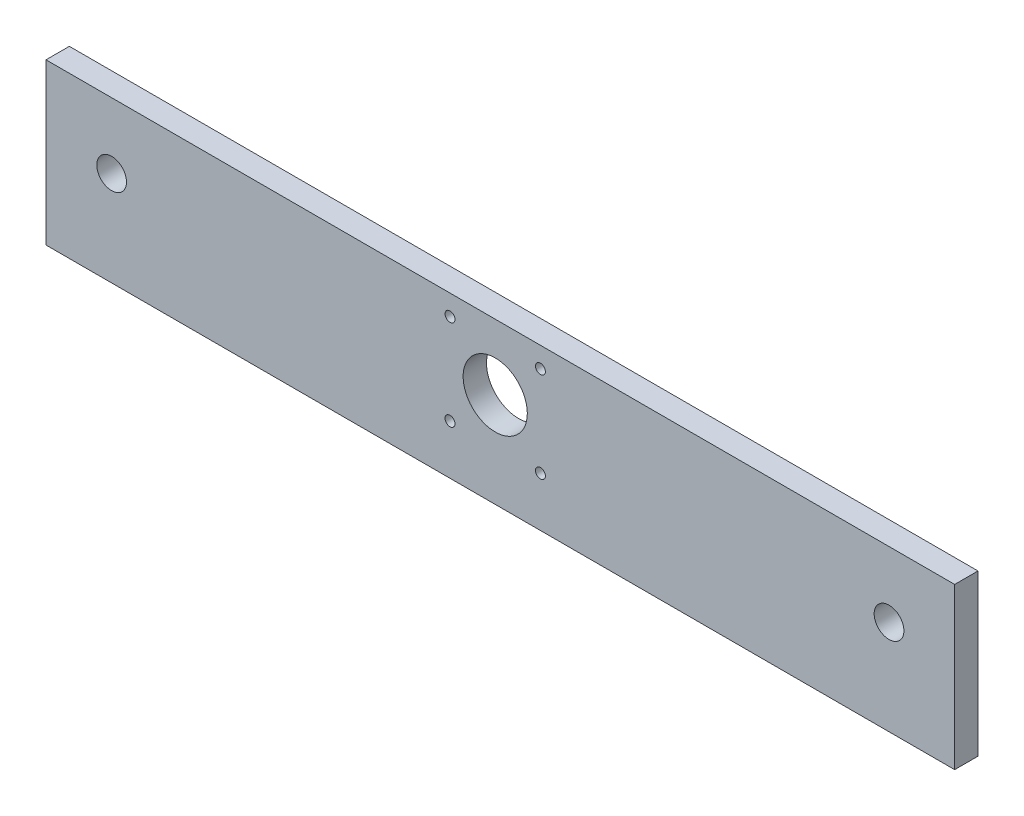
ISO-10303-21;
HEADER;
FILE_DESCRIPTION(('STEP AP214'),'2;1');
FILE_NAME('part.step','',(''),(''),'','','');
FILE_SCHEMA(('AUTOMOTIVE_DESIGN { 1 0 10303 214 1 1 1 1 }'));
ENDSEC;
DATA;
#1=APPLICATION_CONTEXT('core data for automotive mechanical design processes');
#2=APPLICATION_PROTOCOL_DEFINITION('international standard','automotive_design',2000,#1);
#3=PRODUCT_CONTEXT('',#1,'mechanical');
#4=PRODUCT('Part','Part','',(#3));
#5=PRODUCT_RELATED_PRODUCT_CATEGORY('part','',(#4));
#6=PRODUCT_DEFINITION_FORMATION('','',#4);
#7=PRODUCT_DEFINITION_CONTEXT('part definition',#1,'design');
#8=PRODUCT_DEFINITION('design','',#6,#7);
#9=PRODUCT_DEFINITION_SHAPE('','',#8);
#10=(LENGTH_UNIT() NAMED_UNIT(*) SI_UNIT(.MILLI.,.METRE.));
#11=(NAMED_UNIT(*) PLANE_ANGLE_UNIT() SI_UNIT($,.RADIAN.));
#12=(NAMED_UNIT(*) SI_UNIT($,.STERADIAN.) SOLID_ANGLE_UNIT());
#13=UNCERTAINTY_MEASURE_WITH_UNIT(LENGTH_MEASURE(1.E-05),#10,'distance_accuracy_value','');
#14=(GEOMETRIC_REPRESENTATION_CONTEXT(3) GLOBAL_UNCERTAINTY_ASSIGNED_CONTEXT((#13)) GLOBAL_UNIT_ASSIGNED_CONTEXT((#10,
#11,#12)) REPRESENTATION_CONTEXT('',''));
#15=CARTESIAN_POINT('',(0.,0.,0.));
#16=DIRECTION('',(0.,0.,1.));
#17=DIRECTION('',(1.,0.,0.));
#18=AXIS2_PLACEMENT_3D('',#15,#16,#17);
#19=CARTESIAN_POINT('',(-155.75,0.,4.));
#20=DIRECTION('',(-1.,0.,0.));
#21=DIRECTION('',(0.,0.,1.));
#22=AXIS2_PLACEMENT_3D('',#19,#20,#21);
#23=PLANE('',#22);
#24=DIRECTION('',(0.,1.,0.));
#25=VECTOR('',#24,1.);
#26=CARTESIAN_POINT('',(-155.75,0.,-4.));
#27=LINE('',#26,#25);
#28=CARTESIAN_POINT('',(-155.75,-32.5,-4.));
#29=VERTEX_POINT('',#28);
#30=CARTESIAN_POINT('',(-155.75,22.5,-4.));
#31=VERTEX_POINT('',#30);
#32=EDGE_CURVE('E166',#29,#31,#27,.T.);
#33=ORIENTED_EDGE('',*,*,#32,.F.);
#34=DIRECTION('',(0.,0.,1.));
#35=VECTOR('',#34,1.);
#36=CARTESIAN_POINT('',(-155.75,-32.5,-4.));
#37=LINE('',#36,#35);
#38=CARTESIAN_POINT('',(-155.75,-32.5,4.));
#39=VERTEX_POINT('',#38);
#40=EDGE_CURVE('E94',#29,#39,#37,.T.);
#41=ORIENTED_EDGE('',*,*,#40,.T.);
#42=DIRECTION('',(0.,1.,0.));
#43=VECTOR('',#42,1.);
#44=CARTESIAN_POINT('',(-155.75,0.,4.));
#45=LINE('',#44,#43);
#46=CARTESIAN_POINT('',(-155.75,22.5,4.));
#47=VERTEX_POINT('',#46);
#48=EDGE_CURVE('E85',#39,#47,#45,.T.);
#49=ORIENTED_EDGE('',*,*,#48,.T.);
#50=DIRECTION('',(0.,0.,-1.));
#51=VECTOR('',#50,1.);
#52=CARTESIAN_POINT('',(-155.75,22.5,4.));
#53=LINE('',#52,#51);
#54=EDGE_CURVE('E47',#47,#31,#53,.T.);
#55=ORIENTED_EDGE('',*,*,#54,.T.);
#56=EDGE_LOOP('',(#33,#41,#49,#55));
#57=FACE_BOUND('',#56,.T.);
#58=ADVANCED_FACE('F39',(#57),#23,.T.);
#59=CARTESIAN_POINT('',(155.75,0.,4.));
#60=DIRECTION('',(-1.,0.,0.));
#61=DIRECTION('',(0.,0.,1.));
#62=AXIS2_PLACEMENT_3D('',#59,#60,#61);
#63=PLANE('',#62);
#64=DIRECTION('',(0.,1.,0.));
#65=VECTOR('',#64,1.);
#66=CARTESIAN_POINT('',(155.75,0.,-4.));
#67=LINE('',#66,#65);
#68=CARTESIAN_POINT('',(155.75,-32.5,-4.));
#69=VERTEX_POINT('',#68);
#70=CARTESIAN_POINT('',(155.75,22.5,-4.));
#71=VERTEX_POINT('',#70);
#72=EDGE_CURVE('E66',#69,#71,#67,.T.);
#73=ORIENTED_EDGE('',*,*,#72,.T.);
#74=DIRECTION('',(0.,0.,-1.));
#75=VECTOR('',#74,1.);
#76=CARTESIAN_POINT('',(155.75,22.5,4.));
#77=LINE('',#76,#75);
#78=CARTESIAN_POINT('',(155.75,22.5,4.));
#79=VERTEX_POINT('',#78);
#80=EDGE_CURVE('E11',#79,#71,#77,.T.);
#81=ORIENTED_EDGE('',*,*,#80,.F.);
#82=DIRECTION('',(0.,1.,0.));
#83=VECTOR('',#82,1.);
#84=CARTESIAN_POINT('',(155.75,0.,4.));
#85=LINE('',#84,#83);
#86=CARTESIAN_POINT('',(155.75,-32.5,4.));
#87=VERTEX_POINT('',#86);
#88=EDGE_CURVE('E79',#87,#79,#85,.T.);
#89=ORIENTED_EDGE('',*,*,#88,.F.);
#90=DIRECTION('',(0.,0.,1.));
#91=VECTOR('',#90,1.);
#92=CARTESIAN_POINT('',(155.75,-32.5,-4.));
#93=LINE('',#92,#91);
#94=EDGE_CURVE('E82',#69,#87,#93,.T.);
#95=ORIENTED_EDGE('',*,*,#94,.F.);
#96=EDGE_LOOP('',(#73,#81,#89,#95));
#97=FACE_BOUND('',#96,.T.);
#98=ADVANCED_FACE('F81',(#97),#63,.F.);
#99=CARTESIAN_POINT('',(0.,22.5,4.));
#100=DIRECTION('',(0.,-1.,0.));
#101=DIRECTION('',(1.,0.,0.));
#102=AXIS2_PLACEMENT_3D('',#99,#100,#101);
#103=PLANE('',#102);
#104=DIRECTION('',(-1.,0.,0.));
#105=VECTOR('',#104,1.);
#106=CARTESIAN_POINT('',(0.,22.5,-4.));
#107=LINE('',#106,#105);
#108=EDGE_CURVE('E169',#71,#31,#107,.T.);
#109=ORIENTED_EDGE('',*,*,#108,.T.);
#110=ORIENTED_EDGE('',*,*,#54,.F.);
#111=DIRECTION('',(-1.,0.,0.));
#112=VECTOR('',#111,1.);
#113=CARTESIAN_POINT('',(0.,22.5,4.));
#114=LINE('',#113,#112);
#115=EDGE_CURVE('E55',#79,#47,#114,.T.);
#116=ORIENTED_EDGE('',*,*,#115,.F.);
#117=ORIENTED_EDGE('',*,*,#80,.T.);
#118=EDGE_LOOP('',(#109,#110,#116,#117));
#119=FACE_BOUND('',#118,.T.);
#120=ADVANCED_FACE('F178',(#119),#103,.F.);
#121=CARTESIAN_POINT('',(0.,0.,4.));
#122=DIRECTION('',(0.,0.,1.));
#123=DIRECTION('',(1.,0.,0.));
#124=AXIS2_PLACEMENT_3D('',#121,#122,#123);
#125=PLANE('',#124);
#126=CARTESIAN_POINT('',(-133.249958453999,1.36934008923562E-06,4.));
#127=DIRECTION('',(0.,0.,1.));
#128=DIRECTION('',(1.,0.,0.));
#129=AXIS2_PLACEMENT_3D('',#126,#127,#128);
#130=CIRCLE('',#129,5.09999999999999);
#131=CARTESIAN_POINT('',(-128.149958453999,1.36934008923562E-06,4.));
#132=VERTEX_POINT('',#131);
#133=EDGE_CURVE('E93',#132,#132,#130,.T.);
#134=ORIENTED_EDGE('',*,*,#133,.F.);
#135=EDGE_LOOP('',(#134));
#136=FACE_BOUND('',#135,.T.);
#137=CARTESIAN_POINT('',(133.24999863065,1.36934406608916E-06,4.));
#138=DIRECTION('',(0.,0.,1.));
#139=DIRECTION('',(1.,0.,0.));
#140=AXIS2_PLACEMENT_3D('',#137,#138,#139);
#141=CIRCLE('',#140,5.09999999999999);
#142=CARTESIAN_POINT('',(138.34999863065,1.36934406608916E-06,4.));
#143=VERTEX_POINT('',#142);
#144=EDGE_CURVE('E108',#143,#143,#141,.T.);
#145=ORIENTED_EDGE('',*,*,#144,.F.);
#146=EDGE_LOOP('',(#145));
#147=FACE_BOUND('',#146,.T.);
#148=CARTESIAN_POINT('',(13.7500000000001,15.5,4.));
#149=DIRECTION('',(0.,0.,-1.));
#150=DIRECTION('',(-1.,0.,0.));
#151=AXIS2_PLACEMENT_3D('',#148,#149,#150);
#152=CIRCLE('',#151,1.7);
#153=CARTESIAN_POINT('',(12.0500000000001,15.5,4.));
#154=VERTEX_POINT('',#153);
#155=EDGE_CURVE('E123',#154,#154,#152,.T.);
#156=ORIENTED_EDGE('',*,*,#155,.T.);
#157=EDGE_LOOP('',(#156));
#158=FACE_BOUND('',#157,.T.);
#159=CARTESIAN_POINT('',(-17.2499999999999,15.5,4.));
#160=DIRECTION('',(0.,0.,-1.));
#161=DIRECTION('',(-1.,0.,0.));
#162=AXIS2_PLACEMENT_3D('',#159,#160,#161);
#163=CIRCLE('',#162,1.7);
#164=CARTESIAN_POINT('',(-18.9499999999999,15.5,4.));
#165=VERTEX_POINT('',#164);
#166=EDGE_CURVE('E135',#165,#165,#163,.T.);
#167=ORIENTED_EDGE('',*,*,#166,.T.);
#168=EDGE_LOOP('',(#167));
#169=FACE_BOUND('',#168,.T.);
#170=CARTESIAN_POINT('',(-17.2499999999999,-15.5,4.));
#171=DIRECTION('',(0.,0.,-1.));
#172=DIRECTION('',(-1.,0.,0.));
#173=AXIS2_PLACEMENT_3D('',#170,#171,#172);
#174=CIRCLE('',#173,1.7);
#175=CARTESIAN_POINT('',(-18.9499999999999,-15.5,4.));
#176=VERTEX_POINT('',#175);
#177=EDGE_CURVE('E147',#176,#176,#174,.T.);
#178=ORIENTED_EDGE('',*,*,#177,.T.);
#179=EDGE_LOOP('',(#178));
#180=FACE_BOUND('',#179,.T.);
#181=CARTESIAN_POINT('',(13.7500000000001,-15.5,4.));
#182=DIRECTION('',(0.,0.,-1.));
#183=DIRECTION('',(-1.,0.,0.));
#184=AXIS2_PLACEMENT_3D('',#181,#182,#183);
#185=CIRCLE('',#184,1.7);
#186=CARTESIAN_POINT('',(12.0500000000001,-15.5,4.));
#187=VERTEX_POINT('',#186);
#188=EDGE_CURVE('E159',#187,#187,#185,.T.);
#189=ORIENTED_EDGE('',*,*,#188,.T.);
#190=EDGE_LOOP('',(#189));
#191=FACE_BOUND('',#190,.T.);
#192=CARTESIAN_POINT('',(-1.74999999999993,0.,4.));
#193=DIRECTION('',(0.,0.,1.));
#194=DIRECTION('',(1.,0.,0.));
#195=AXIS2_PLACEMENT_3D('',#192,#193,#194);
#196=CIRCLE('',#195,11.);
#197=CARTESIAN_POINT('',(9.25000000000007,0.,4.));
#198=VERTEX_POINT('',#197);
#199=EDGE_CURVE('E162',#198,#198,#196,.T.);
#200=ORIENTED_EDGE('',*,*,#199,.F.);
#201=EDGE_LOOP('',(#200));
#202=FACE_BOUND('',#201,.T.);
#203=ORIENTED_EDGE('',*,*,#48,.F.);
#204=DIRECTION('',(1.,0.,0.));
#205=VECTOR('',#204,1.);
#206=CARTESIAN_POINT('',(-155.75,-32.5,4.));
#207=LINE('',#206,#205);
#208=EDGE_CURVE('E91',#39,#87,#207,.T.);
#209=ORIENTED_EDGE('',*,*,#208,.T.);
#210=ORIENTED_EDGE('',*,*,#88,.T.);
#211=ORIENTED_EDGE('',*,*,#115,.T.);
#212=EDGE_LOOP('',(#203,#209,#210,#211));
#213=FACE_BOUND('',#212,.T.);
#214=ADVANCED_FACE('F96',(#136,#147,#158,#169,#180,#191,#202,#213),#125,.T.);
#215=CARTESIAN_POINT('',(0.,0.,-4.));
#216=DIRECTION('',(0.,0.,1.));
#217=DIRECTION('',(1.,0.,0.));
#218=AXIS2_PLACEMENT_3D('',#215,#216,#217);
#219=PLANE('',#218);
#220=CARTESIAN_POINT('',(-133.249958453999,1.36934008923562E-06,-4.00000000000001));
#221=DIRECTION('',(0.,0.,1.));
#222=DIRECTION('',(1.,0.,0.));
#223=AXIS2_PLACEMENT_3D('',#220,#221,#222);
#224=CIRCLE('',#223,5.09999999999999);
#225=CARTESIAN_POINT('',(-128.149958453999,1.36934008923562E-06,-4.00000000000001));
#226=VERTEX_POINT('',#225);
#227=EDGE_CURVE('E105',#226,#226,#224,.T.);
#228=ORIENTED_EDGE('',*,*,#227,.T.);
#229=EDGE_LOOP('',(#228));
#230=FACE_BOUND('',#229,.T.);
#231=CARTESIAN_POINT('',(133.24999863065,1.36934406608916E-06,-4.00000000000001));
#232=DIRECTION('',(0.,0.,1.));
#233=DIRECTION('',(1.,0.,0.));
#234=AXIS2_PLACEMENT_3D('',#231,#232,#233);
#235=CIRCLE('',#234,5.09999999999999);
#236=CARTESIAN_POINT('',(138.34999863065,1.36934406608916E-06,-4.00000000000001));
#237=VERTEX_POINT('',#236);
#238=EDGE_CURVE('E111',#237,#237,#235,.T.);
#239=ORIENTED_EDGE('',*,*,#238,.T.);
#240=EDGE_LOOP('',(#239));
#241=FACE_BOUND('',#240,.T.);
#242=CARTESIAN_POINT('',(13.7500000000001,15.5,-4.));
#243=DIRECTION('',(0.,0.,-1.));
#244=DIRECTION('',(-1.,0.,0.));
#245=AXIS2_PLACEMENT_3D('',#242,#243,#244);
#246=CIRCLE('',#245,3.25);
#247=CARTESIAN_POINT('',(10.5000000000001,15.5,-4.));
#248=VERTEX_POINT('',#247);
#249=EDGE_CURVE('E114',#248,#248,#246,.T.);
#250=ORIENTED_EDGE('',*,*,#249,.F.);
#251=EDGE_LOOP('',(#250));
#252=FACE_BOUND('',#251,.T.);
#253=CARTESIAN_POINT('',(-17.2499999999999,15.5,-4.));
#254=DIRECTION('',(0.,0.,-1.));
#255=DIRECTION('',(-1.,0.,0.));
#256=AXIS2_PLACEMENT_3D('',#253,#254,#255);
#257=CIRCLE('',#256,3.25);
#258=CARTESIAN_POINT('',(-20.4999999999999,15.5,-4.));
#259=VERTEX_POINT('',#258);
#260=EDGE_CURVE('E126',#259,#259,#257,.T.);
#261=ORIENTED_EDGE('',*,*,#260,.F.);
#262=EDGE_LOOP('',(#261));
#263=FACE_BOUND('',#262,.T.);
#264=CARTESIAN_POINT('',(-17.2499999999999,-15.5,-4.));
#265=DIRECTION('',(0.,0.,-1.));
#266=DIRECTION('',(-1.,0.,0.));
#267=AXIS2_PLACEMENT_3D('',#264,#265,#266);
#268=CIRCLE('',#267,3.25);
#269=CARTESIAN_POINT('',(-20.4999999999999,-15.5,-4.));
#270=VERTEX_POINT('',#269);
#271=EDGE_CURVE('E138',#270,#270,#268,.T.);
#272=ORIENTED_EDGE('',*,*,#271,.F.);
#273=EDGE_LOOP('',(#272));
#274=FACE_BOUND('',#273,.T.);
#275=CARTESIAN_POINT('',(13.7500000000001,-15.5,-4.));
#276=DIRECTION('',(0.,0.,-1.));
#277=DIRECTION('',(-1.,0.,0.));
#278=AXIS2_PLACEMENT_3D('',#275,#276,#277);
#279=CIRCLE('',#278,3.25);
#280=CARTESIAN_POINT('',(10.5000000000001,-15.5,-4.));
#281=VERTEX_POINT('',#280);
#282=EDGE_CURVE('E150',#281,#281,#279,.T.);
#283=ORIENTED_EDGE('',*,*,#282,.F.);
#284=EDGE_LOOP('',(#283));
#285=FACE_BOUND('',#284,.T.);
#286=CARTESIAN_POINT('',(-1.74999999999993,0.,-4.));
#287=DIRECTION('',(0.,0.,1.));
#288=DIRECTION('',(1.,0.,0.));
#289=AXIS2_PLACEMENT_3D('',#286,#287,#288);
#290=CIRCLE('',#289,11.);
#291=CARTESIAN_POINT('',(9.25000000000007,0.,-4.));
#292=VERTEX_POINT('',#291);
#293=EDGE_CURVE('E163',#292,#292,#290,.T.);
#294=ORIENTED_EDGE('',*,*,#293,.T.);
#295=EDGE_LOOP('',(#294));
#296=FACE_BOUND('',#295,.T.);
#297=ORIENTED_EDGE('',*,*,#32,.T.);
#298=ORIENTED_EDGE('',*,*,#108,.F.);
#299=ORIENTED_EDGE('',*,*,#72,.F.);
#300=DIRECTION('',(1.,0.,0.));
#301=VECTOR('',#300,1.);
#302=CARTESIAN_POINT('',(-155.75,-32.5,-4.));
#303=LINE('',#302,#301);
#304=EDGE_CURVE('E92',#29,#69,#303,.T.);
#305=ORIENTED_EDGE('',*,*,#304,.F.);
#306=EDGE_LOOP('',(#297,#298,#299,#305));
#307=FACE_BOUND('',#306,.T.);
#308=ADVANCED_FACE('F179',(#230,#241,#252,#263,#274,#285,#296,#307),#219,.F.);
#309=CARTESIAN_POINT('',(-1.74999999999993,0.,-4.));
#310=DIRECTION('',(0.,0.,1.));
#311=DIRECTION('',(1.,0.,0.));
#312=AXIS2_PLACEMENT_3D('',#309,#310,#311);
#313=CYLINDRICAL_SURFACE('',#312,11.);
#314=ORIENTED_EDGE('',*,*,#293,.F.);
#315=EDGE_LOOP('',(#314));
#316=FACE_BOUND('',#315,.T.);
#317=ORIENTED_EDGE('',*,*,#199,.T.);
#318=EDGE_LOOP('',(#317));
#319=FACE_BOUND('',#318,.T.);
#320=ADVANCED_FACE('F181',(#316,#319),#313,.F.);
#321=CARTESIAN_POINT('',(13.7500000000001,-15.5,-4.));
#322=DIRECTION('',(0.,0.,-1.));
#323=DIRECTION('',(-1.,0.,0.));
#324=AXIS2_PLACEMENT_3D('',#321,#322,#323);
#325=CYLINDRICAL_SURFACE('',#324,1.7);
#326=ORIENTED_EDGE('',*,*,#188,.F.);
#327=EDGE_LOOP('',(#326));
#328=FACE_BOUND('',#327,.T.);
#329=CARTESIAN_POINT('',(13.7500000000001,-15.5,-0.6));
#330=DIRECTION('',(0.,0.,-1.));
#331=DIRECTION('',(-1.,0.,0.));
#332=AXIS2_PLACEMENT_3D('',#329,#330,#331);
#333=CIRCLE('',#332,1.7);
#334=CARTESIAN_POINT('',(12.0500000000001,-15.5,-0.6));
#335=VERTEX_POINT('',#334);
#336=EDGE_CURVE('E156',#335,#335,#333,.T.);
#337=ORIENTED_EDGE('',*,*,#336,.T.);
#338=EDGE_LOOP('',(#337));
#339=FACE_BOUND('',#338,.T.);
#340=ADVANCED_FACE('F188',(#328,#339),#325,.F.);
#341=CARTESIAN_POINT('',(15.4500000000001,-15.5,-0.6));
#342=DIRECTION('',(0.,0.,1.));
#343=DIRECTION('',(1.,0.,0.));
#344=AXIS2_PLACEMENT_3D('',#341,#342,#343);
#345=PLANE('',#344);
#346=ORIENTED_EDGE('',*,*,#336,.F.);
#347=EDGE_LOOP('',(#346));
#348=FACE_BOUND('',#347,.T.);
#349=CARTESIAN_POINT('',(13.7500000000001,-15.5,-0.6));
#350=DIRECTION('',(0.,0.,-1.));
#351=DIRECTION('',(-1.,0.,0.));
#352=AXIS2_PLACEMENT_3D('',#349,#350,#351);
#353=CIRCLE('',#352,3.25);
#354=CARTESIAN_POINT('',(10.5000000000001,-15.5,-0.6));
#355=VERTEX_POINT('',#354);
#356=EDGE_CURVE('E153',#355,#355,#353,.T.);
#357=ORIENTED_EDGE('',*,*,#356,.T.);
#358=EDGE_LOOP('',(#357));
#359=FACE_BOUND('',#358,.T.);
#360=ADVANCED_FACE('F324',(#348,#359),#345,.F.);
#361=CARTESIAN_POINT('',(13.7500000000001,-15.5,-4.));
#362=DIRECTION('',(0.,0.,-1.));
#363=DIRECTION('',(-1.,0.,0.));
#364=AXIS2_PLACEMENT_3D('',#361,#362,#363);
#365=CYLINDRICAL_SURFACE('',#364,3.25);
#366=ORIENTED_EDGE('',*,*,#356,.F.);
#367=EDGE_LOOP('',(#366));
#368=FACE_BOUND('',#367,.T.);
#369=ORIENTED_EDGE('',*,*,#282,.T.);
#370=EDGE_LOOP('',(#369));
#371=FACE_BOUND('',#370,.T.);
#372=ADVANCED_FACE('F316',(#368,#371),#365,.F.);
#373=CARTESIAN_POINT('',(-17.2499999999999,-15.5,-4.));
#374=DIRECTION('',(0.,0.,-1.));
#375=DIRECTION('',(-1.,0.,0.));
#376=AXIS2_PLACEMENT_3D('',#373,#374,#375);
#377=CYLINDRICAL_SURFACE('',#376,1.7);
#378=ORIENTED_EDGE('',*,*,#177,.F.);
#379=EDGE_LOOP('',(#378));
#380=FACE_BOUND('',#379,.T.);
#381=CARTESIAN_POINT('',(-17.2499999999999,-15.5,-0.6));
#382=DIRECTION('',(0.,0.,-1.));
#383=DIRECTION('',(-1.,0.,0.));
#384=AXIS2_PLACEMENT_3D('',#381,#382,#383);
#385=CIRCLE('',#384,1.7);
#386=CARTESIAN_POINT('',(-18.9499999999999,-15.5,-0.6));
#387=VERTEX_POINT('',#386);
#388=EDGE_CURVE('E144',#387,#387,#385,.T.);
#389=ORIENTED_EDGE('',*,*,#388,.T.);
#390=EDGE_LOOP('',(#389));
#391=FACE_BOUND('',#390,.T.);
#392=ADVANCED_FACE('F308',(#380,#391),#377,.F.);
#393=CARTESIAN_POINT('',(-15.5499999999999,-15.5,-0.6));
#394=DIRECTION('',(0.,0.,1.));
#395=DIRECTION('',(1.,0.,0.));
#396=AXIS2_PLACEMENT_3D('',#393,#394,#395);
#397=PLANE('',#396);
#398=ORIENTED_EDGE('',*,*,#388,.F.);
#399=EDGE_LOOP('',(#398));
#400=FACE_BOUND('',#399,.T.);
#401=CARTESIAN_POINT('',(-17.2499999999999,-15.5,-0.6));
#402=DIRECTION('',(0.,0.,-1.));
#403=DIRECTION('',(-1.,0.,0.));
#404=AXIS2_PLACEMENT_3D('',#401,#402,#403);
#405=CIRCLE('',#404,3.25);
#406=CARTESIAN_POINT('',(-20.4999999999999,-15.5,-0.6));
#407=VERTEX_POINT('',#406);
#408=EDGE_CURVE('E141',#407,#407,#405,.T.);
#409=ORIENTED_EDGE('',*,*,#408,.T.);
#410=EDGE_LOOP('',(#409));
#411=FACE_BOUND('',#410,.T.);
#412=ADVANCED_FACE('F300',(#400,#411),#397,.F.);
#413=CARTESIAN_POINT('',(-17.2499999999999,-15.5,-4.));
#414=DIRECTION('',(0.,0.,-1.));
#415=DIRECTION('',(-1.,0.,0.));
#416=AXIS2_PLACEMENT_3D('',#413,#414,#415);
#417=CYLINDRICAL_SURFACE('',#416,3.25);
#418=ORIENTED_EDGE('',*,*,#408,.F.);
#419=EDGE_LOOP('',(#418));
#420=FACE_BOUND('',#419,.T.);
#421=ORIENTED_EDGE('',*,*,#271,.T.);
#422=EDGE_LOOP('',(#421));
#423=FACE_BOUND('',#422,.T.);
#424=ADVANCED_FACE('F292',(#420,#423),#417,.F.);
#425=CARTESIAN_POINT('',(-17.2499999999999,15.5,-4.));
#426=DIRECTION('',(0.,0.,-1.));
#427=DIRECTION('',(-1.,0.,0.));
#428=AXIS2_PLACEMENT_3D('',#425,#426,#427);
#429=CYLINDRICAL_SURFACE('',#428,1.7);
#430=ORIENTED_EDGE('',*,*,#166,.F.);
#431=EDGE_LOOP('',(#430));
#432=FACE_BOUND('',#431,.T.);
#433=CARTESIAN_POINT('',(-17.2499999999999,15.5,-0.6));
#434=DIRECTION('',(0.,0.,-1.));
#435=DIRECTION('',(-1.,0.,0.));
#436=AXIS2_PLACEMENT_3D('',#433,#434,#435);
#437=CIRCLE('',#436,1.7);
#438=CARTESIAN_POINT('',(-18.9499999999999,15.5,-0.6));
#439=VERTEX_POINT('',#438);
#440=EDGE_CURVE('E132',#439,#439,#437,.T.);
#441=ORIENTED_EDGE('',*,*,#440,.T.);
#442=EDGE_LOOP('',(#441));
#443=FACE_BOUND('',#442,.T.);
#444=ADVANCED_FACE('F284',(#432,#443),#429,.F.);
#445=CARTESIAN_POINT('',(-15.5499999999999,15.5,-0.6));
#446=DIRECTION('',(0.,0.,1.));
#447=DIRECTION('',(1.,0.,0.));
#448=AXIS2_PLACEMENT_3D('',#445,#446,#447);
#449=PLANE('',#448);
#450=ORIENTED_EDGE('',*,*,#440,.F.);
#451=EDGE_LOOP('',(#450));
#452=FACE_BOUND('',#451,.T.);
#453=CARTESIAN_POINT('',(-17.2499999999999,15.5,-0.6));
#454=DIRECTION('',(0.,0.,-1.));
#455=DIRECTION('',(-1.,0.,0.));
#456=AXIS2_PLACEMENT_3D('',#453,#454,#455);
#457=CIRCLE('',#456,3.25);
#458=CARTESIAN_POINT('',(-20.4999999999999,15.5,-0.6));
#459=VERTEX_POINT('',#458);
#460=EDGE_CURVE('E129',#459,#459,#457,.T.);
#461=ORIENTED_EDGE('',*,*,#460,.T.);
#462=EDGE_LOOP('',(#461));
#463=FACE_BOUND('',#462,.T.);
#464=ADVANCED_FACE('F276',(#452,#463),#449,.F.);
#465=CARTESIAN_POINT('',(-17.2499999999999,15.5,-4.));
#466=DIRECTION('',(0.,0.,-1.));
#467=DIRECTION('',(-1.,0.,0.));
#468=AXIS2_PLACEMENT_3D('',#465,#466,#467);
#469=CYLINDRICAL_SURFACE('',#468,3.25);
#470=ORIENTED_EDGE('',*,*,#460,.F.);
#471=EDGE_LOOP('',(#470));
#472=FACE_BOUND('',#471,.T.);
#473=ORIENTED_EDGE('',*,*,#260,.T.);
#474=EDGE_LOOP('',(#473));
#475=FACE_BOUND('',#474,.T.);
#476=ADVANCED_FACE('F268',(#472,#475),#469,.F.);
#477=CARTESIAN_POINT('',(13.7500000000001,15.5,-4.));
#478=DIRECTION('',(0.,0.,-1.));
#479=DIRECTION('',(-1.,0.,0.));
#480=AXIS2_PLACEMENT_3D('',#477,#478,#479);
#481=CYLINDRICAL_SURFACE('',#480,1.7);
#482=ORIENTED_EDGE('',*,*,#155,.F.);
#483=EDGE_LOOP('',(#482));
#484=FACE_BOUND('',#483,.T.);
#485=CARTESIAN_POINT('',(13.7500000000001,15.5,-0.6));
#486=DIRECTION('',(0.,0.,-1.));
#487=DIRECTION('',(-1.,0.,0.));
#488=AXIS2_PLACEMENT_3D('',#485,#486,#487);
#489=CIRCLE('',#488,1.7);
#490=CARTESIAN_POINT('',(12.0500000000001,15.5,-0.6));
#491=VERTEX_POINT('',#490);
#492=EDGE_CURVE('E120',#491,#491,#489,.T.);
#493=ORIENTED_EDGE('',*,*,#492,.T.);
#494=EDGE_LOOP('',(#493));
#495=FACE_BOUND('',#494,.T.);
#496=ADVANCED_FACE('F260',(#484,#495),#481,.F.);
#497=CARTESIAN_POINT('',(15.4500000000001,15.5,-0.6));
#498=DIRECTION('',(0.,0.,1.));
#499=DIRECTION('',(1.,0.,0.));
#500=AXIS2_PLACEMENT_3D('',#497,#498,#499);
#501=PLANE('',#500);
#502=ORIENTED_EDGE('',*,*,#492,.F.);
#503=EDGE_LOOP('',(#502));
#504=FACE_BOUND('',#503,.T.);
#505=CARTESIAN_POINT('',(13.7500000000001,15.5,-0.6));
#506=DIRECTION('',(0.,0.,-1.));
#507=DIRECTION('',(-1.,0.,0.));
#508=AXIS2_PLACEMENT_3D('',#505,#506,#507);
#509=CIRCLE('',#508,3.25);
#510=CARTESIAN_POINT('',(10.5000000000001,15.5,-0.6));
#511=VERTEX_POINT('',#510);
#512=EDGE_CURVE('E117',#511,#511,#509,.T.);
#513=ORIENTED_EDGE('',*,*,#512,.T.);
#514=EDGE_LOOP('',(#513));
#515=FACE_BOUND('',#514,.T.);
#516=ADVANCED_FACE('F252',(#504,#515),#501,.F.);
#517=CARTESIAN_POINT('',(13.7500000000001,15.5,-4.));
#518=DIRECTION('',(0.,0.,-1.));
#519=DIRECTION('',(-1.,0.,0.));
#520=AXIS2_PLACEMENT_3D('',#517,#518,#519);
#521=CYLINDRICAL_SURFACE('',#520,3.25);
#522=ORIENTED_EDGE('',*,*,#512,.F.);
#523=EDGE_LOOP('',(#522));
#524=FACE_BOUND('',#523,.T.);
#525=ORIENTED_EDGE('',*,*,#249,.T.);
#526=EDGE_LOOP('',(#525));
#527=FACE_BOUND('',#526,.T.);
#528=ADVANCED_FACE('F244',(#524,#527),#521,.F.);
#529=CARTESIAN_POINT('',(133.24999863065,1.36934406608916E-06,4.));
#530=DIRECTION('',(0.,0.,1.));
#531=DIRECTION('',(1.,0.,0.));
#532=AXIS2_PLACEMENT_3D('',#529,#530,#531);
#533=CYLINDRICAL_SURFACE('',#532,5.09999999999999);
#534=ORIENTED_EDGE('',*,*,#238,.F.);
#535=EDGE_LOOP('',(#534));
#536=FACE_BOUND('',#535,.T.);
#537=ORIENTED_EDGE('',*,*,#144,.T.);
#538=EDGE_LOOP('',(#537));
#539=FACE_BOUND('',#538,.T.);
#540=ADVANCED_FACE('F236',(#536,#539),#533,.F.);
#541=CARTESIAN_POINT('',(-133.249958453999,1.36934008923562E-06,4.));
#542=DIRECTION('',(0.,0.,1.));
#543=DIRECTION('',(1.,0.,0.));
#544=AXIS2_PLACEMENT_3D('',#541,#542,#543);
#545=CYLINDRICAL_SURFACE('',#544,5.09999999999999);
#546=ORIENTED_EDGE('',*,*,#227,.F.);
#547=EDGE_LOOP('',(#546));
#548=FACE_BOUND('',#547,.T.);
#549=ORIENTED_EDGE('',*,*,#133,.T.);
#550=EDGE_LOOP('',(#549));
#551=FACE_BOUND('',#550,.T.);
#552=ADVANCED_FACE('F226',(#548,#551),#545,.F.);
#553=CARTESIAN_POINT('',(-155.75,-32.5,-4.));
#554=DIRECTION('',(0.,-1.,0.));
#555=DIRECTION('',(0.,0.,-1.));
#556=AXIS2_PLACEMENT_3D('',#553,#554,#555);
#557=PLANE('',#556);
#558=ORIENTED_EDGE('',*,*,#208,.F.);
#559=ORIENTED_EDGE('',*,*,#40,.F.);
#560=ORIENTED_EDGE('',*,*,#304,.T.);
#561=ORIENTED_EDGE('',*,*,#94,.T.);
#562=EDGE_LOOP('',(#558,#559,#560,#561));
#563=FACE_BOUND('',#562,.T.);
#564=ADVANCED_FACE('F89',(#563),#557,.T.);
#565=CLOSED_SHELL('',(#58,#98,#120,#214,#308,#320,#340,#360,#372,#392,#412,#424,#444,#464,#476,
#496,#516,#528,#540,#552,#564));
#566=MANIFOLD_SOLID_BREP('B2',#565);
#567=ADVANCED_BREP_SHAPE_REPRESENTATION('',(#18,#566),#14);
#568=SHAPE_DEFINITION_REPRESENTATION(#9,#567);
ENDSEC;
END-ISO-10303-21;
